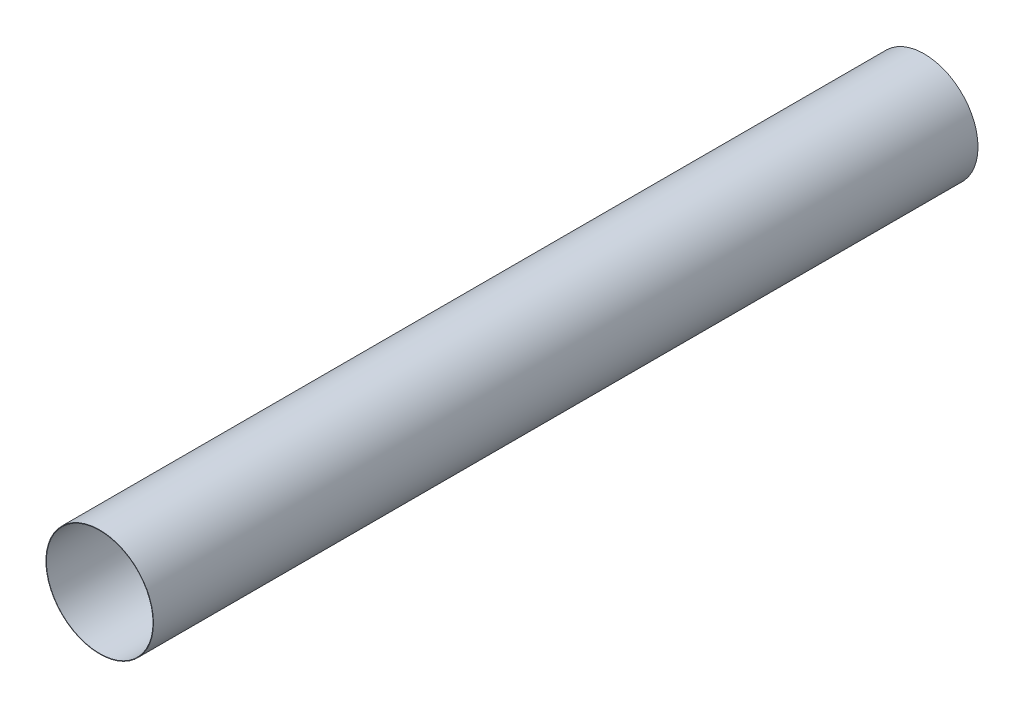
ISO-10303-21;
HEADER;
FILE_DESCRIPTION(('STEP AP214'),'2;1');
FILE_NAME('part.step','',(''),(''),'','','');
FILE_SCHEMA(('AUTOMOTIVE_DESIGN { 1 0 10303 214 1 1 1 1 }'));
ENDSEC;
DATA;
#1=APPLICATION_CONTEXT('core data for automotive mechanical design processes');
#2=APPLICATION_PROTOCOL_DEFINITION('international standard','automotive_design',2000,#1);
#3=PRODUCT_CONTEXT('',#1,'mechanical');
#4=PRODUCT('Part','Part','',(#3));
#5=PRODUCT_RELATED_PRODUCT_CATEGORY('part','',(#4));
#6=PRODUCT_DEFINITION_FORMATION('','',#4);
#7=PRODUCT_DEFINITION_CONTEXT('part definition',#1,'design');
#8=PRODUCT_DEFINITION('design','',#6,#7);
#9=PRODUCT_DEFINITION_SHAPE('','',#8);
#10=(LENGTH_UNIT() NAMED_UNIT(*) SI_UNIT(.MILLI.,.METRE.));
#11=(NAMED_UNIT(*) PLANE_ANGLE_UNIT() SI_UNIT($,.RADIAN.));
#12=(NAMED_UNIT(*) SI_UNIT($,.STERADIAN.) SOLID_ANGLE_UNIT());
#13=UNCERTAINTY_MEASURE_WITH_UNIT(LENGTH_MEASURE(1.E-05),#10,'distance_accuracy_value','');
#14=(GEOMETRIC_REPRESENTATION_CONTEXT(3) GLOBAL_UNCERTAINTY_ASSIGNED_CONTEXT((#13)) GLOBAL_UNIT_ASSIGNED_CONTEXT((#10,
#11,#12)) REPRESENTATION_CONTEXT('',''));
#15=CARTESIAN_POINT('',(0.,0.,0.));
#16=DIRECTION('',(0.,0.,1.));
#17=DIRECTION('',(1.,0.,0.));
#18=AXIS2_PLACEMENT_3D('',#15,#16,#17);
#19=CARTESIAN_POINT('',(0.,0.,146.05));
#20=DIRECTION('',(0.,0.,1.));
#21=DIRECTION('',(1.,0.,0.));
#22=AXIS2_PLACEMENT_3D('',#19,#20,#21);
#23=PLANE('',#22);
#24=CARTESIAN_POINT('',(0.,0.,146.05));
#25=DIRECTION('',(0.,0.,1.));
#26=DIRECTION('',(1.,0.,0.));
#27=AXIS2_PLACEMENT_3D('',#24,#25,#26);
#28=CIRCLE('',#27,9.525);
#29=CARTESIAN_POINT('',(9.525,0.,146.05));
#30=VERTEX_POINT('',#29);
#31=EDGE_CURVE('E10',#30,#30,#28,.T.);
#32=ORIENTED_EDGE('',*,*,#31,.T.);
#33=EDGE_LOOP('',(#32));
#34=FACE_BOUND('',#33,.T.);
#35=CARTESIAN_POINT('',(0.,0.,146.05));
#36=DIRECTION('',(0.,0.,1.));
#37=DIRECTION('',(1.,0.,0.));
#38=AXIS2_PLACEMENT_3D('',#35,#36,#37);
#39=CIRCLE('',#38,9.4488);
#40=CARTESIAN_POINT('',(9.4488,0.,146.05));
#41=VERTEX_POINT('',#40);
#42=EDGE_CURVE('E48',#41,#41,#39,.T.);
#43=ORIENTED_EDGE('',*,*,#42,.F.);
#44=EDGE_LOOP('',(#43));
#45=FACE_BOUND('',#44,.T.);
#46=ADVANCED_FACE('F37',(#34,#45),#23,.T.);
#47=CARTESIAN_POINT('',(0.,0.,0.));
#48=DIRECTION('',(0.,0.,1.));
#49=DIRECTION('',(1.,0.,0.));
#50=AXIS2_PLACEMENT_3D('',#47,#48,#49);
#51=PLANE('',#50);
#52=CARTESIAN_POINT('',(0.,0.,0.));
#53=DIRECTION('',(0.,0.,1.));
#54=DIRECTION('',(1.,0.,0.));
#55=AXIS2_PLACEMENT_3D('',#52,#53,#54);
#56=CIRCLE('',#55,9.525);
#57=CARTESIAN_POINT('',(9.525,0.,0.));
#58=VERTEX_POINT('',#57);
#59=EDGE_CURVE('E41',#58,#58,#56,.T.);
#60=ORIENTED_EDGE('',*,*,#59,.F.);
#61=EDGE_LOOP('',(#60));
#62=FACE_BOUND('',#61,.T.);
#63=CARTESIAN_POINT('',(0.,0.,0.));
#64=DIRECTION('',(0.,0.,1.));
#65=DIRECTION('',(1.,0.,0.));
#66=AXIS2_PLACEMENT_3D('',#63,#64,#65);
#67=CIRCLE('',#66,9.4488);
#68=CARTESIAN_POINT('',(9.4488,0.,0.));
#69=VERTEX_POINT('',#68);
#70=EDGE_CURVE('E50',#69,#69,#67,.T.);
#71=ORIENTED_EDGE('',*,*,#70,.T.);
#72=EDGE_LOOP('',(#71));
#73=FACE_BOUND('',#72,.T.);
#74=ADVANCED_FACE('F60',(#62,#73),#51,.F.);
#75=CARTESIAN_POINT('',(0.,0.,146.05));
#76=DIRECTION('',(0.,0.,-1.));
#77=DIRECTION('',(-1.,0.,0.));
#78=AXIS2_PLACEMENT_3D('',#75,#76,#77);
#79=CYLINDRICAL_SURFACE('',#78,9.525);
#80=ORIENTED_EDGE('',*,*,#31,.F.);
#81=EDGE_LOOP('',(#80));
#82=FACE_BOUND('',#81,.T.);
#83=ORIENTED_EDGE('',*,*,#59,.T.);
#84=EDGE_LOOP('',(#83));
#85=FACE_BOUND('',#84,.T.);
#86=ADVANCED_FACE('F39',(#82,#85),#79,.T.);
#87=CARTESIAN_POINT('',(0.,0.,146.05));
#88=DIRECTION('',(0.,0.,-1.));
#89=DIRECTION('',(-1.,0.,0.));
#90=AXIS2_PLACEMENT_3D('',#87,#88,#89);
#91=CYLINDRICAL_SURFACE('',#90,9.4488);
#92=ORIENTED_EDGE('',*,*,#42,.T.);
#93=EDGE_LOOP('',(#92));
#94=FACE_BOUND('',#93,.T.);
#95=ORIENTED_EDGE('',*,*,#70,.F.);
#96=EDGE_LOOP('',(#95));
#97=FACE_BOUND('',#96,.T.);
#98=ADVANCED_FACE('F56',(#94,#97),#91,.F.);
#99=CLOSED_SHELL('',(#46,#74,#86,#98));
#100=MANIFOLD_SOLID_BREP('B2',#99);
#101=ADVANCED_BREP_SHAPE_REPRESENTATION('',(#18,#100),#14);
#102=SHAPE_DEFINITION_REPRESENTATION(#9,#101);
ENDSEC;
END-ISO-10303-21;
